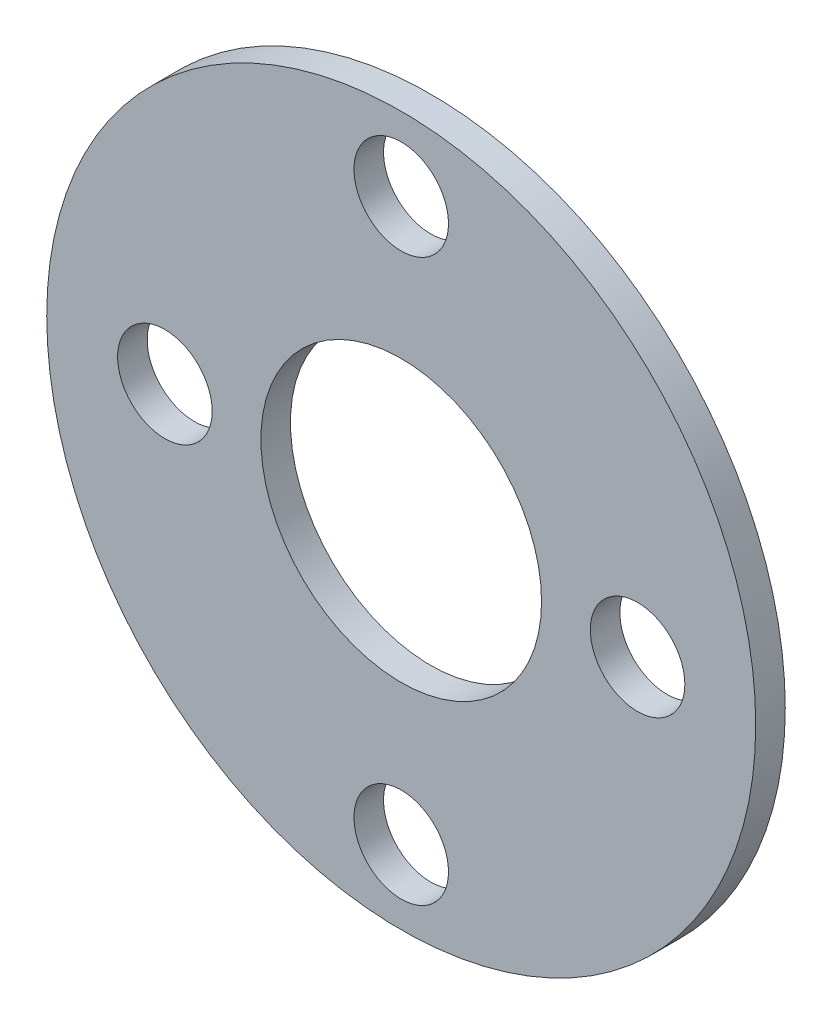
ISO-10303-21;
HEADER;
FILE_DESCRIPTION(('STEP AP214'),'2;1');
FILE_NAME('part.step','',(''),(''),'','','');
FILE_SCHEMA(('AUTOMOTIVE_DESIGN { 1 0 10303 214 1 1 1 1 }'));
ENDSEC;
DATA;
#1=APPLICATION_CONTEXT('core data for automotive mechanical design processes');
#2=APPLICATION_PROTOCOL_DEFINITION('international standard','automotive_design',2000,#1);
#3=PRODUCT_CONTEXT('',#1,'mechanical');
#4=PRODUCT('Part','Part','',(#3));
#5=PRODUCT_RELATED_PRODUCT_CATEGORY('part','',(#4));
#6=PRODUCT_DEFINITION_FORMATION('','',#4);
#7=PRODUCT_DEFINITION_CONTEXT('part definition',#1,'design');
#8=PRODUCT_DEFINITION('design','',#6,#7);
#9=PRODUCT_DEFINITION_SHAPE('','',#8);
#10=(LENGTH_UNIT() NAMED_UNIT(*) SI_UNIT(.MILLI.,.METRE.));
#11=(NAMED_UNIT(*) PLANE_ANGLE_UNIT() SI_UNIT($,.RADIAN.));
#12=(NAMED_UNIT(*) SI_UNIT($,.STERADIAN.) SOLID_ANGLE_UNIT());
#13=UNCERTAINTY_MEASURE_WITH_UNIT(LENGTH_MEASURE(1.E-05),#10,'distance_accuracy_value','');
#14=(GEOMETRIC_REPRESENTATION_CONTEXT(3) GLOBAL_UNCERTAINTY_ASSIGNED_CONTEXT((#13)) GLOBAL_UNIT_ASSIGNED_CONTEXT((#10,
#11,#12)) REPRESENTATION_CONTEXT('',''));
#15=CARTESIAN_POINT('',(0.,0.,0.));
#16=DIRECTION('',(0.,0.,1.));
#17=DIRECTION('',(1.,0.,0.));
#18=AXIS2_PLACEMENT_3D('',#15,#16,#17);
#19=CARTESIAN_POINT('',(0.,0.,1.));
#20=DIRECTION('',(0.,0.,1.));
#21=DIRECTION('',(1.,0.,0.));
#22=AXIS2_PLACEMENT_3D('',#19,#20,#21);
#23=PLANE('',#22);
#24=CARTESIAN_POINT('',(0.,9.5,1.));
#25=DIRECTION('',(0.,0.,1.));
#26=DIRECTION('',(1.,0.,0.));
#27=AXIS2_PLACEMENT_3D('',#24,#25,#26);
#28=CIRCLE('',#27,1.6);
#29=CARTESIAN_POINT('',(1.6,9.5,1.));
#30=VERTEX_POINT('',#29);
#31=EDGE_CURVE('E60',#30,#30,#28,.T.);
#32=ORIENTED_EDGE('',*,*,#31,.F.);
#33=EDGE_LOOP('',(#32));
#34=FACE_BOUND('',#33,.T.);
#35=CARTESIAN_POINT('',(8.,0.,1.));
#36=DIRECTION('',(0.,0.,1.));
#37=DIRECTION('',(1.,0.,0.));
#38=AXIS2_PLACEMENT_3D('',#35,#36,#37);
#39=CIRCLE('',#38,1.6);
#40=CARTESIAN_POINT('',(9.6,0.,1.));
#41=VERTEX_POINT('',#40);
#42=EDGE_CURVE('E48',#41,#41,#39,.T.);
#43=ORIENTED_EDGE('',*,*,#42,.F.);
#44=EDGE_LOOP('',(#43));
#45=FACE_BOUND('',#44,.T.);
#46=CARTESIAN_POINT('',(0.,0.,1.));
#47=DIRECTION('',(0.,0.,1.));
#48=DIRECTION('',(1.,0.,0.));
#49=AXIS2_PLACEMENT_3D('',#46,#47,#48);
#50=CIRCLE('',#49,12.);
#51=CARTESIAN_POINT('',(12.,0.,1.));
#52=VERTEX_POINT('',#51);
#53=EDGE_CURVE('E10',#52,#52,#50,.T.);
#54=ORIENTED_EDGE('',*,*,#53,.T.);
#55=EDGE_LOOP('',(#54));
#56=FACE_BOUND('',#55,.T.);
#57=CARTESIAN_POINT('',(0.,0.,1.));
#58=DIRECTION('',(0.,0.,1.));
#59=DIRECTION('',(1.,0.,0.));
#60=AXIS2_PLACEMENT_3D('',#57,#58,#59);
#61=CIRCLE('',#60,4.75);
#62=CARTESIAN_POINT('',(4.75,0.,1.));
#63=VERTEX_POINT('',#62);
#64=EDGE_CURVE('E43',#63,#63,#61,.T.);
#65=ORIENTED_EDGE('',*,*,#64,.F.);
#66=EDGE_LOOP('',(#65));
#67=FACE_BOUND('',#66,.T.);
#68=CARTESIAN_POINT('',(-8.,0.,1.));
#69=DIRECTION('',(0.,0.,1.));
#70=DIRECTION('',(1.,0.,0.));
#71=AXIS2_PLACEMENT_3D('',#68,#69,#70);
#72=CIRCLE('',#71,1.6);
#73=CARTESIAN_POINT('',(-6.4,0.,1.));
#74=VERTEX_POINT('',#73);
#75=EDGE_CURVE('E54',#74,#74,#72,.T.);
#76=ORIENTED_EDGE('',*,*,#75,.F.);
#77=EDGE_LOOP('',(#76));
#78=FACE_BOUND('',#77,.T.);
#79=CARTESIAN_POINT('',(0.,-9.5,1.));
#80=DIRECTION('',(0.,0.,1.));
#81=DIRECTION('',(1.,0.,0.));
#82=AXIS2_PLACEMENT_3D('',#79,#80,#81);
#83=CIRCLE('',#82,1.6);
#84=CARTESIAN_POINT('',(1.6,-9.5,1.));
#85=VERTEX_POINT('',#84);
#86=EDGE_CURVE('E66',#85,#85,#83,.T.);
#87=ORIENTED_EDGE('',*,*,#86,.F.);
#88=EDGE_LOOP('',(#87));
#89=FACE_BOUND('',#88,.T.);
#90=ADVANCED_FACE('F32',(#34,#45,#56,#67,#78,#89),#23,.T.);
#91=CARTESIAN_POINT('',(0.,0.,0.));
#92=DIRECTION('',(0.,0.,1.));
#93=DIRECTION('',(1.,0.,0.));
#94=AXIS2_PLACEMENT_3D('',#91,#92,#93);
#95=PLANE('',#94);
#96=CARTESIAN_POINT('',(0.,0.,0.));
#97=DIRECTION('',(0.,0.,1.));
#98=DIRECTION('',(1.,0.,0.));
#99=AXIS2_PLACEMENT_3D('',#96,#97,#98);
#100=CIRCLE('',#99,12.);
#101=CARTESIAN_POINT('',(12.,0.,0.));
#102=VERTEX_POINT('',#101);
#103=EDGE_CURVE('E36',#102,#102,#100,.T.);
#104=ORIENTED_EDGE('',*,*,#103,.F.);
#105=EDGE_LOOP('',(#104));
#106=FACE_BOUND('',#105,.T.);
#107=CARTESIAN_POINT('',(0.,0.,0.));
#108=DIRECTION('',(0.,0.,1.));
#109=DIRECTION('',(1.,0.,0.));
#110=AXIS2_PLACEMENT_3D('',#107,#108,#109);
#111=CIRCLE('',#110,4.75);
#112=CARTESIAN_POINT('',(4.75,0.,0.));
#113=VERTEX_POINT('',#112);
#114=EDGE_CURVE('E45',#113,#113,#111,.T.);
#115=ORIENTED_EDGE('',*,*,#114,.T.);
#116=EDGE_LOOP('',(#115));
#117=FACE_BOUND('',#116,.T.);
#118=CARTESIAN_POINT('',(8.,0.,0.));
#119=DIRECTION('',(0.,0.,1.));
#120=DIRECTION('',(1.,0.,0.));
#121=AXIS2_PLACEMENT_3D('',#118,#119,#120);
#122=CIRCLE('',#121,1.6);
#123=CARTESIAN_POINT('',(9.6,0.,0.));
#124=VERTEX_POINT('',#123);
#125=EDGE_CURVE('E51',#124,#124,#122,.T.);
#126=ORIENTED_EDGE('',*,*,#125,.T.);
#127=EDGE_LOOP('',(#126));
#128=FACE_BOUND('',#127,.T.);
#129=CARTESIAN_POINT('',(-8.,0.,0.));
#130=DIRECTION('',(0.,0.,1.));
#131=DIRECTION('',(1.,0.,0.));
#132=AXIS2_PLACEMENT_3D('',#129,#130,#131);
#133=CIRCLE('',#132,1.6);
#134=CARTESIAN_POINT('',(-6.4,0.,0.));
#135=VERTEX_POINT('',#134);
#136=EDGE_CURVE('E57',#135,#135,#133,.T.);
#137=ORIENTED_EDGE('',*,*,#136,.T.);
#138=EDGE_LOOP('',(#137));
#139=FACE_BOUND('',#138,.T.);
#140=CARTESIAN_POINT('',(0.,9.5,0.));
#141=DIRECTION('',(0.,0.,1.));
#142=DIRECTION('',(1.,0.,0.));
#143=AXIS2_PLACEMENT_3D('',#140,#141,#142);
#144=CIRCLE('',#143,1.6);
#145=CARTESIAN_POINT('',(1.6,9.5,0.));
#146=VERTEX_POINT('',#145);
#147=EDGE_CURVE('E63',#146,#146,#144,.T.);
#148=ORIENTED_EDGE('',*,*,#147,.T.);
#149=EDGE_LOOP('',(#148));
#150=FACE_BOUND('',#149,.T.);
#151=CARTESIAN_POINT('',(0.,-9.5,0.));
#152=DIRECTION('',(0.,0.,1.));
#153=DIRECTION('',(1.,0.,0.));
#154=AXIS2_PLACEMENT_3D('',#151,#152,#153);
#155=CIRCLE('',#154,1.6);
#156=CARTESIAN_POINT('',(1.6,-9.5,0.));
#157=VERTEX_POINT('',#156);
#158=EDGE_CURVE('E69',#157,#157,#155,.T.);
#159=ORIENTED_EDGE('',*,*,#158,.T.);
#160=EDGE_LOOP('',(#159));
#161=FACE_BOUND('',#160,.T.);
#162=ADVANCED_FACE('F79',(#106,#117,#128,#139,#150,#161),#95,.F.);
#163=CARTESIAN_POINT('',(0.,0.,1.));
#164=DIRECTION('',(0.,0.,-1.));
#165=DIRECTION('',(-1.,0.,0.));
#166=AXIS2_PLACEMENT_3D('',#163,#164,#165);
#167=CYLINDRICAL_SURFACE('',#166,12.);
#168=ORIENTED_EDGE('',*,*,#53,.F.);
#169=EDGE_LOOP('',(#168));
#170=FACE_BOUND('',#169,.T.);
#171=ORIENTED_EDGE('',*,*,#103,.T.);
#172=EDGE_LOOP('',(#171));
#173=FACE_BOUND('',#172,.T.);
#174=ADVANCED_FACE('F34',(#170,#173),#167,.T.);
#175=CARTESIAN_POINT('',(0.,0.,1.));
#176=DIRECTION('',(0.,0.,-1.));
#177=DIRECTION('',(-1.,0.,0.));
#178=AXIS2_PLACEMENT_3D('',#175,#176,#177);
#179=CYLINDRICAL_SURFACE('',#178,4.75);
#180=ORIENTED_EDGE('',*,*,#64,.T.);
#181=EDGE_LOOP('',(#180));
#182=FACE_BOUND('',#181,.T.);
#183=ORIENTED_EDGE('',*,*,#114,.F.);
#184=EDGE_LOOP('',(#183));
#185=FACE_BOUND('',#184,.T.);
#186=ADVANCED_FACE('F89',(#182,#185),#179,.F.);
#187=CARTESIAN_POINT('',(8.,0.,1.));
#188=DIRECTION('',(0.,0.,-1.));
#189=DIRECTION('',(-1.,0.,0.));
#190=AXIS2_PLACEMENT_3D('',#187,#188,#189);
#191=CYLINDRICAL_SURFACE('',#190,1.6);
#192=ORIENTED_EDGE('',*,*,#42,.T.);
#193=EDGE_LOOP('',(#192));
#194=FACE_BOUND('',#193,.T.);
#195=ORIENTED_EDGE('',*,*,#125,.F.);
#196=EDGE_LOOP('',(#195));
#197=FACE_BOUND('',#196,.T.);
#198=ADVANCED_FACE('F92',(#194,#197),#191,.F.);
#199=CARTESIAN_POINT('',(-8.,0.,1.));
#200=DIRECTION('',(0.,0.,-1.));
#201=DIRECTION('',(-1.,0.,0.));
#202=AXIS2_PLACEMENT_3D('',#199,#200,#201);
#203=CYLINDRICAL_SURFACE('',#202,1.6);
#204=ORIENTED_EDGE('',*,*,#75,.T.);
#205=EDGE_LOOP('',(#204));
#206=FACE_BOUND('',#205,.T.);
#207=ORIENTED_EDGE('',*,*,#136,.F.);
#208=EDGE_LOOP('',(#207));
#209=FACE_BOUND('',#208,.T.);
#210=ADVANCED_FACE('F96',(#206,#209),#203,.F.);
#211=CARTESIAN_POINT('',(0.,9.5,1.));
#212=DIRECTION('',(0.,0.,-1.));
#213=DIRECTION('',(-1.,0.,0.));
#214=AXIS2_PLACEMENT_3D('',#211,#212,#213);
#215=CYLINDRICAL_SURFACE('',#214,1.6);
#216=ORIENTED_EDGE('',*,*,#31,.T.);
#217=EDGE_LOOP('',(#216));
#218=FACE_BOUND('',#217,.T.);
#219=ORIENTED_EDGE('',*,*,#147,.F.);
#220=EDGE_LOOP('',(#219));
#221=FACE_BOUND('',#220,.T.);
#222=ADVANCED_FACE('F100',(#218,#221),#215,.F.);
#223=CARTESIAN_POINT('',(0.,-9.5,1.));
#224=DIRECTION('',(0.,0.,-1.));
#225=DIRECTION('',(-1.,0.,0.));
#226=AXIS2_PLACEMENT_3D('',#223,#224,#225);
#227=CYLINDRICAL_SURFACE('',#226,1.6);
#228=ORIENTED_EDGE('',*,*,#86,.T.);
#229=EDGE_LOOP('',(#228));
#230=FACE_BOUND('',#229,.T.);
#231=ORIENTED_EDGE('',*,*,#158,.F.);
#232=EDGE_LOOP('',(#231));
#233=FACE_BOUND('',#232,.T.);
#234=ADVANCED_FACE('F75',(#230,#233),#227,.F.);
#235=CLOSED_SHELL('',(#90,#162,#174,#186,#198,#210,#222,#234));
#236=MANIFOLD_SOLID_BREP('B2',#235);
#237=ADVANCED_BREP_SHAPE_REPRESENTATION('',(#18,#236),#14);
#238=SHAPE_DEFINITION_REPRESENTATION(#9,#237);
ENDSEC;
END-ISO-10303-21;
